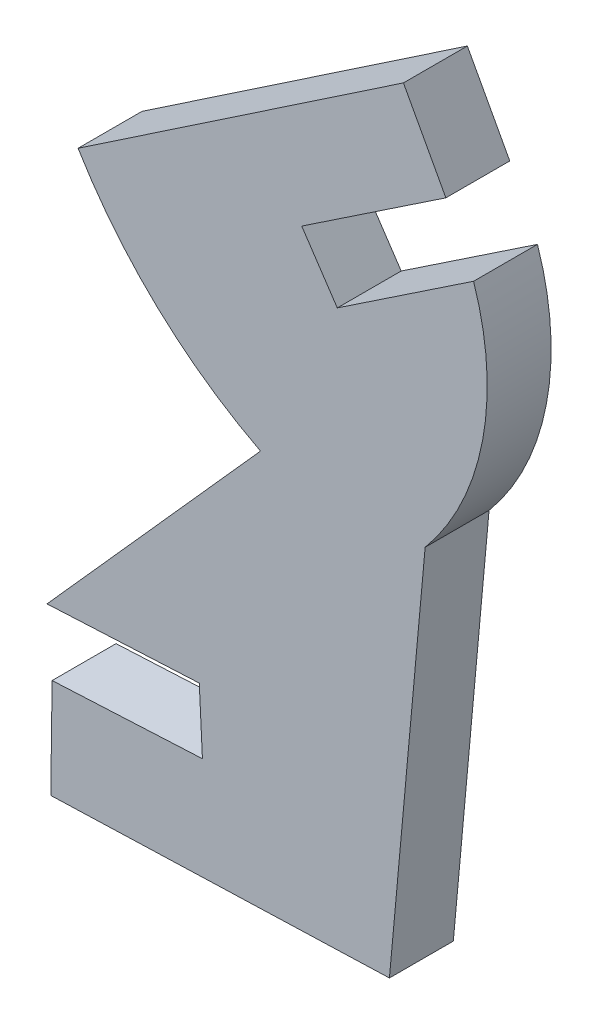
ISO-10303-21;
HEADER;
FILE_DESCRIPTION(('STEP AP214'),'2;1');
FILE_NAME('part.step','',(''),(''),'','','');
FILE_SCHEMA(('AUTOMOTIVE_DESIGN { 1 0 10303 214 1 1 1 1 }'));
ENDSEC;
DATA;
#1=APPLICATION_CONTEXT('core data for automotive mechanical design processes');
#2=APPLICATION_PROTOCOL_DEFINITION('international standard','automotive_design',2000,#1);
#3=PRODUCT_CONTEXT('',#1,'mechanical');
#4=PRODUCT('Part','Part','',(#3));
#5=PRODUCT_RELATED_PRODUCT_CATEGORY('part','',(#4));
#6=PRODUCT_DEFINITION_FORMATION('','',#4);
#7=PRODUCT_DEFINITION_CONTEXT('part definition',#1,'design');
#8=PRODUCT_DEFINITION('design','',#6,#7);
#9=PRODUCT_DEFINITION_SHAPE('','',#8);
#10=(LENGTH_UNIT() NAMED_UNIT(*) SI_UNIT(.MILLI.,.METRE.));
#11=(NAMED_UNIT(*) PLANE_ANGLE_UNIT() SI_UNIT($,.RADIAN.));
#12=(NAMED_UNIT(*) SI_UNIT($,.STERADIAN.) SOLID_ANGLE_UNIT());
#13=UNCERTAINTY_MEASURE_WITH_UNIT(LENGTH_MEASURE(1.E-05),#10,'distance_accuracy_value','');
#14=(GEOMETRIC_REPRESENTATION_CONTEXT(3) GLOBAL_UNCERTAINTY_ASSIGNED_CONTEXT((#13)) GLOBAL_UNIT_ASSIGNED_CONTEXT((#10,
#11,#12)) REPRESENTATION_CONTEXT('',''));
#15=CARTESIAN_POINT('',(0.,0.,0.));
#16=DIRECTION('',(0.,0.,1.));
#17=DIRECTION('',(1.,0.,0.));
#18=AXIS2_PLACEMENT_3D('',#15,#16,#17);
#19=CARTESIAN_POINT('',(155.295598835879,-41.1938991259459,3.));
#20=DIRECTION('',(-0.0332427425840476,0.999447307298134,0.));
#21=DIRECTION('',(-0.999447307298134,-0.0332427425840476,0.));
#22=AXIS2_PLACEMENT_3D('',#19,#20,#21);
#23=PLANE('',#22);
#24=DIRECTION('',(0.999447307298134,0.0332427425840476,0.));
#25=VECTOR('',#24,1.);
#26=CARTESIAN_POINT('',(155.295598835879,-41.1938991259459,0.));
#27=LINE('',#26,#25);
#28=CARTESIAN_POINT('',(155.295598835879,-41.1938991259459,0.));
#29=VERTEX_POINT('',#28);
#30=CARTESIAN_POINT('',(171.19295744218,-40.6651350820022,0.));
#31=VERTEX_POINT('',#30);
#32=EDGE_CURVE('E136',#29,#31,#27,.T.);
#33=ORIENTED_EDGE('',*,*,#32,.T.);
#34=DIRECTION('',(0.,0.,-1.));
#35=VECTOR('',#34,1.);
#36=CARTESIAN_POINT('',(171.19295744218,-40.6651350820022,3.));
#37=LINE('',#36,#35);
#38=CARTESIAN_POINT('',(171.19295744218,-40.6651350820022,3.));
#39=VERTEX_POINT('',#38);
#40=EDGE_CURVE('E11',#39,#31,#37,.T.);
#41=ORIENTED_EDGE('',*,*,#40,.F.);
#42=DIRECTION('',(0.999447307298134,0.0332427425840476,0.));
#43=VECTOR('',#42,1.);
#44=CARTESIAN_POINT('',(155.295598835879,-41.1938991259459,3.));
#45=LINE('',#44,#43);
#46=CARTESIAN_POINT('',(155.295598835879,-41.1938991259459,3.));
#47=VERTEX_POINT('',#46);
#48=EDGE_CURVE('E175',#47,#39,#45,.T.);
#49=ORIENTED_EDGE('',*,*,#48,.F.);
#50=DIRECTION('',(0.,0.,-1.));
#51=VECTOR('',#50,1.);
#52=CARTESIAN_POINT('',(155.295598835879,-41.1938991259459,3.));
#53=LINE('',#52,#51);
#54=EDGE_CURVE('E149',#47,#29,#53,.T.);
#55=ORIENTED_EDGE('',*,*,#54,.T.);
#56=EDGE_LOOP('',(#33,#41,#49,#55));
#57=FACE_BOUND('',#56,.T.);
#58=ADVANCED_FACE('F32',(#57),#23,.F.);
#59=CARTESIAN_POINT('',(171.19295744218,-40.6651350820022,3.));
#60=DIRECTION('',(-0.995849609156195,0.0910140425618661,0.));
#61=DIRECTION('',(-0.0910140425618661,-0.995849609156195,0.));
#62=AXIS2_PLACEMENT_3D('',#59,#60,#61);
#63=PLANE('',#62);
#64=DIRECTION('',(0.0910140425618662,0.995849609156195,0.));
#65=VECTOR('',#64,1.);
#66=CARTESIAN_POINT('',(171.19295744218,-40.6651350820022,0.));
#67=LINE('',#66,#65);
#68=CARTESIAN_POINT('',(172.870030556164,-22.3150809796199,0.));
#69=VERTEX_POINT('',#68);
#70=EDGE_CURVE('E132',#31,#69,#67,.T.);
#71=ORIENTED_EDGE('',*,*,#70,.T.);
#72=DIRECTION('',(0.,0.,-1.));
#73=VECTOR('',#72,1.);
#74=CARTESIAN_POINT('',(172.870030556164,-22.3150809796199,3.));
#75=LINE('',#74,#73);
#76=CARTESIAN_POINT('',(172.870030556164,-22.3150809796199,3.));
#77=VERTEX_POINT('',#76);
#78=EDGE_CURVE('E39',#77,#69,#75,.T.);
#79=ORIENTED_EDGE('',*,*,#78,.F.);
#80=DIRECTION('',(0.0910140425618662,0.995849609156195,0.));
#81=VECTOR('',#80,1.);
#82=CARTESIAN_POINT('',(171.19295744218,-40.6651350820022,3.));
#83=LINE('',#82,#81);
#84=EDGE_CURVE('E145',#39,#77,#83,.T.);
#85=ORIENTED_EDGE('',*,*,#84,.F.);
#86=ORIENTED_EDGE('',*,*,#40,.T.);
#87=EDGE_LOOP('',(#71,#79,#85,#86));
#88=FACE_BOUND('',#87,.T.);
#89=ADVANCED_FACE('F144',(#88),#63,.F.);
#90=CARTESIAN_POINT('',(163.32426821129,-14.3087299020398,3.));
#91=DIRECTION('',(0.,0.,-1.));
#92=DIRECTION('',(-1.,0.,0.));
#93=AXIS2_PLACEMENT_3D('',#90,#91,#92);
#94=CYLINDRICAL_SURFACE('',#93,12.4588617586953);
#95=CARTESIAN_POINT('',(163.32426821129,-14.3087299020398,0.));
#96=DIRECTION('',(0.,0.,1.));
#97=DIRECTION('',(1.,0.,0.));
#98=AXIS2_PLACEMENT_3D('',#95,#96,#97);
#99=CIRCLE('',#98,12.4588617586953);
#100=CARTESIAN_POINT('',(175.142919491838,-10.3663044771169,0.));
#101=VERTEX_POINT('',#100);
#102=EDGE_CURVE('E138',#69,#101,#99,.T.);
#103=ORIENTED_EDGE('',*,*,#102,.T.);
#104=DIRECTION('',(0.,0.,-1.));
#105=VECTOR('',#104,1.);
#106=CARTESIAN_POINT('',(175.142919491838,-10.3663044771169,3.));
#107=LINE('',#106,#105);
#108=CARTESIAN_POINT('',(175.142919491838,-10.3663044771169,3.));
#109=VERTEX_POINT('',#108);
#110=EDGE_CURVE('E231',#109,#101,#107,.T.);
#111=ORIENTED_EDGE('',*,*,#110,.F.);
#112=CARTESIAN_POINT('',(163.32426821129,-14.3087299020398,3.));
#113=DIRECTION('',(0.,0.,1.));
#114=DIRECTION('',(1.,0.,0.));
#115=AXIS2_PLACEMENT_3D('',#112,#113,#114);
#116=CIRCLE('',#115,12.4588617586953);
#117=EDGE_CURVE('E178',#77,#109,#116,.T.);
#118=ORIENTED_EDGE('',*,*,#117,.F.);
#119=ORIENTED_EDGE('',*,*,#78,.T.);
#120=EDGE_LOOP('',(#103,#111,#118,#119));
#121=FACE_BOUND('',#120,.T.);
#122=ADVANCED_FACE('F235',(#121),#94,.T.);
#123=CARTESIAN_POINT('',(175.142919491838,-10.3663044771169,3.));
#124=DIRECTION('',(0.556308239600081,-0.830976018037259,0.));
#125=DIRECTION('',(0.830976018037259,0.556308239600081,0.));
#126=AXIS2_PLACEMENT_3D('',#123,#124,#125);
#127=PLANE('',#126);
#128=DIRECTION('',(-0.830976018037259,-0.556308239600081,0.));
#129=VECTOR('',#128,1.);
#130=CARTESIAN_POINT('',(175.142919491838,-10.3663044771169,0.));
#131=LINE('',#130,#129);
#132=CARTESIAN_POINT('',(168.744811213556,-14.6496054097583,0.));
#133=VERTEX_POINT('',#132);
#134=EDGE_CURVE('E153',#101,#133,#131,.T.);
#135=ORIENTED_EDGE('',*,*,#134,.T.);
#136=DIRECTION('',(0.,0.,-1.));
#137=VECTOR('',#136,1.);
#138=CARTESIAN_POINT('',(168.744811213556,-14.6496054097583,3.));
#139=LINE('',#138,#137);
#140=CARTESIAN_POINT('',(168.744811213556,-14.6496054097583,3.));
#141=VERTEX_POINT('',#140);
#142=EDGE_CURVE('E228',#141,#133,#139,.T.);
#143=ORIENTED_EDGE('',*,*,#142,.F.);
#144=DIRECTION('',(-0.830976018037259,-0.556308239600081,0.));
#145=VECTOR('',#144,1.);
#146=CARTESIAN_POINT('',(175.142919491838,-10.3663044771169,3.));
#147=LINE('',#146,#145);
#148=EDGE_CURVE('E180',#109,#141,#147,.T.);
#149=ORIENTED_EDGE('',*,*,#148,.F.);
#150=ORIENTED_EDGE('',*,*,#110,.T.);
#151=EDGE_LOOP('',(#135,#143,#149,#150));
#152=FACE_BOUND('',#151,.T.);
#153=ADVANCED_FACE('F243',(#152),#127,.F.);
#154=CARTESIAN_POINT('',(168.744811213556,-14.6496054097583,3.));
#155=DIRECTION('',(-0.830976018037261,-0.556308239600078,0.));
#156=DIRECTION('',(0.556308239600078,-0.830976018037261,0.));
#157=AXIS2_PLACEMENT_3D('',#154,#155,#156);
#158=PLANE('',#157);
#159=DIRECTION('',(-0.556308239600078,0.830976018037261,0.));
#160=VECTOR('',#159,1.);
#161=CARTESIAN_POINT('',(168.744811213556,-14.6496054097583,0.));
#162=LINE('',#161,#160);
#163=CARTESIAN_POINT('',(167.075886494756,-12.1566773556466,0.));
#164=VERTEX_POINT('',#163);
#165=EDGE_CURVE('E155',#133,#164,#162,.T.);
#166=ORIENTED_EDGE('',*,*,#165,.T.);
#167=DIRECTION('',(0.,0.,-1.));
#168=VECTOR('',#167,1.);
#169=CARTESIAN_POINT('',(167.075886494756,-12.1566773556466,3.));
#170=LINE('',#169,#168);
#171=CARTESIAN_POINT('',(167.075886494756,-12.1566773556466,3.));
#172=VERTEX_POINT('',#171);
#173=EDGE_CURVE('E225',#172,#164,#170,.T.);
#174=ORIENTED_EDGE('',*,*,#173,.F.);
#175=DIRECTION('',(-0.556308239600078,0.830976018037261,0.));
#176=VECTOR('',#175,1.);
#177=CARTESIAN_POINT('',(168.744811213556,-14.6496054097583,3.));
#178=LINE('',#177,#176);
#179=EDGE_CURVE('E182',#141,#172,#178,.T.);
#180=ORIENTED_EDGE('',*,*,#179,.F.);
#181=ORIENTED_EDGE('',*,*,#142,.T.);
#182=EDGE_LOOP('',(#166,#174,#180,#181));
#183=FACE_BOUND('',#182,.T.);
#184=ADVANCED_FACE('F246',(#183),#158,.F.);
#185=CARTESIAN_POINT('',(167.075886494756,-12.1566773556466,3.));
#186=DIRECTION('',(-0.556308239600081,0.830976018037259,0.));
#187=DIRECTION('',(-0.830976018037259,-0.556308239600081,0.));
#188=AXIS2_PLACEMENT_3D('',#185,#186,#187);
#189=PLANE('',#188);
#190=DIRECTION('',(0.830976018037259,0.556308239600081,0.));
#191=VECTOR('',#190,1.);
#192=CARTESIAN_POINT('',(167.075886494756,-12.1566773556466,0.));
#193=LINE('',#192,#191);
#194=CARTESIAN_POINT('',(173.841852344708,-7.62710914972925,0.));
#195=VERTEX_POINT('',#194);
#196=EDGE_CURVE('E157',#164,#195,#193,.T.);
#197=ORIENTED_EDGE('',*,*,#196,.T.);
#198=DIRECTION('',(0.,0.,-1.));
#199=VECTOR('',#198,1.);
#200=CARTESIAN_POINT('',(173.841852344708,-7.62710914972925,3.));
#201=LINE('',#200,#199);
#202=CARTESIAN_POINT('',(173.841852344708,-7.62710914972925,3.));
#203=VERTEX_POINT('',#202);
#204=EDGE_CURVE('E222',#203,#195,#201,.T.);
#205=ORIENTED_EDGE('',*,*,#204,.F.);
#206=DIRECTION('',(0.830976018037259,0.556308239600081,0.));
#207=VECTOR('',#206,1.);
#208=CARTESIAN_POINT('',(167.075886494756,-12.1566773556466,3.));
#209=LINE('',#208,#207);
#210=EDGE_CURVE('E184',#172,#203,#209,.T.);
#211=ORIENTED_EDGE('',*,*,#210,.F.);
#212=ORIENTED_EDGE('',*,*,#173,.T.);
#213=EDGE_LOOP('',(#197,#205,#211,#212));
#214=FACE_BOUND('',#213,.T.);
#215=ADVANCED_FACE('F251',(#214),#189,.F.);
#216=CARTESIAN_POINT('',(173.841852344708,-7.62710914972925,3.));
#217=DIRECTION('',(-0.879337576268163,-0.476198936331059,0.));
#218=DIRECTION('',(0.476198936331059,-0.879337576268163,0.));
#219=AXIS2_PLACEMENT_3D('',#216,#217,#218);
#220=PLANE('',#219);
#221=DIRECTION('',(-0.47619893633106,0.879337576268163,0.));
#222=VECTOR('',#221,1.);
#223=CARTESIAN_POINT('',(173.841852344708,-7.62710914972925,0.));
#224=LINE('',#223,#222);
#225=CARTESIAN_POINT('',(171.850357265324,-3.94966192620568,0.));
#226=VERTEX_POINT('',#225);
#227=EDGE_CURVE('E159',#195,#226,#224,.T.);
#228=ORIENTED_EDGE('',*,*,#227,.T.);
#229=DIRECTION('',(0.,0.,-1.));
#230=VECTOR('',#229,1.);
#231=CARTESIAN_POINT('',(171.850357265324,-3.94966192620568,3.));
#232=LINE('',#231,#230);
#233=CARTESIAN_POINT('',(171.850357265324,-3.94966192620568,3.));
#234=VERTEX_POINT('',#233);
#235=EDGE_CURVE('E219',#234,#226,#232,.T.);
#236=ORIENTED_EDGE('',*,*,#235,.F.);
#237=DIRECTION('',(-0.47619893633106,0.879337576268163,0.));
#238=VECTOR('',#237,1.);
#239=CARTESIAN_POINT('',(173.841852344708,-7.62710914972925,3.));
#240=LINE('',#239,#238);
#241=EDGE_CURVE('E186',#203,#234,#240,.T.);
#242=ORIENTED_EDGE('',*,*,#241,.F.);
#243=ORIENTED_EDGE('',*,*,#204,.T.);
#244=EDGE_LOOP('',(#228,#236,#242,#243));
#245=FACE_BOUND('',#244,.T.);
#246=ADVANCED_FACE('F257',(#245),#220,.F.);
#247=CARTESIAN_POINT('',(171.850357265324,-3.94966192620568,3.));
#248=DIRECTION('',(0.558860818011676,-0.829261470280225,0.));
#249=DIRECTION('',(0.829261470280225,0.558860818011676,0.));
#250=AXIS2_PLACEMENT_3D('',#247,#248,#249);
#251=PLANE('',#250);
#252=DIRECTION('',(-0.829261470280225,-0.558860818011676,0.));
#253=VECTOR('',#252,1.);
#254=CARTESIAN_POINT('',(171.850357265324,-3.94966192620568,0.));
#255=LINE('',#254,#253);
#256=CARTESIAN_POINT('',(156.578082960375,-14.2420437826528,0.));
#257=VERTEX_POINT('',#256);
#258=EDGE_CURVE('E161',#226,#257,#255,.T.);
#259=ORIENTED_EDGE('',*,*,#258,.T.);
#260=DIRECTION('',(0.,0.,-1.));
#261=VECTOR('',#260,1.);
#262=CARTESIAN_POINT('',(156.578082960375,-14.2420437826528,3.));
#263=LINE('',#262,#261);
#264=CARTESIAN_POINT('',(156.578082960375,-14.2420437826528,3.));
#265=VERTEX_POINT('',#264);
#266=EDGE_CURVE('E216',#265,#257,#263,.T.);
#267=ORIENTED_EDGE('',*,*,#266,.F.);
#268=DIRECTION('',(-0.829261470280225,-0.558860818011676,0.));
#269=VECTOR('',#268,1.);
#270=CARTESIAN_POINT('',(171.850357265324,-3.94966192620568,3.));
#271=LINE('',#270,#269);
#272=EDGE_CURVE('E188',#234,#265,#271,.T.);
#273=ORIENTED_EDGE('',*,*,#272,.F.);
#274=ORIENTED_EDGE('',*,*,#235,.T.);
#275=EDGE_LOOP('',(#259,#267,#273,#274));
#276=FACE_BOUND('',#275,.T.);
#277=ADVANCED_FACE('F261',(#276),#251,.F.);
#278=CARTESIAN_POINT('',(175.020876678863,-3.15397513301595,3.));
#279=DIRECTION('',(0.,0.,-1.));
#280=DIRECTION('',(-1.,0.,0.));
#281=AXIS2_PLACEMENT_3D('',#278,#279,#280);
#282=CYLINDRICAL_SURFACE('',#281,21.5193379666237);
#283=CARTESIAN_POINT('',(175.020876678863,-3.15397513301595,0.));
#284=DIRECTION('',(0.,0.,1.));
#285=DIRECTION('',(1.,0.,0.));
#286=AXIS2_PLACEMENT_3D('',#283,#284,#285);
#287=CIRCLE('',#286,21.5193379666237);
#288=CARTESIAN_POINT('',(165.140644270391,-22.2710594838355,0.));
#289=VERTEX_POINT('',#288);
#290=EDGE_CURVE('E163',#257,#289,#287,.T.);
#291=ORIENTED_EDGE('',*,*,#290,.T.);
#292=DIRECTION('',(0.,0.,-1.));
#293=VECTOR('',#292,1.);
#294=CARTESIAN_POINT('',(165.140644270391,-22.2710594838355,3.));
#295=LINE('',#294,#293);
#296=CARTESIAN_POINT('',(165.140644270391,-22.2710594838355,3.));
#297=VERTEX_POINT('',#296);
#298=EDGE_CURVE('E213',#297,#289,#295,.T.);
#299=ORIENTED_EDGE('',*,*,#298,.F.);
#300=CARTESIAN_POINT('',(175.020876678863,-3.15397513301595,3.));
#301=DIRECTION('',(0.,0.,1.));
#302=DIRECTION('',(1.,0.,0.));
#303=AXIS2_PLACEMENT_3D('',#300,#301,#302);
#304=CIRCLE('',#303,21.5193379666237);
#305=EDGE_CURVE('E190',#265,#297,#304,.T.);
#306=ORIENTED_EDGE('',*,*,#305,.F.);
#307=ORIENTED_EDGE('',*,*,#266,.T.);
#308=EDGE_LOOP('',(#291,#299,#306,#307));
#309=FACE_BOUND('',#308,.T.);
#310=ADVANCED_FACE('F266',(#309),#282,.T.);
#311=CARTESIAN_POINT('',(165.140644270391,-22.2710594838355,3.));
#312=DIRECTION('',(0.745889748074085,-0.666069428601837,0.));
#313=DIRECTION('',(0.666069428601837,0.745889748074085,0.));
#314=AXIS2_PLACEMENT_3D('',#311,#312,#313);
#315=PLANE('',#314);
#316=DIRECTION('',(-0.666069428601837,-0.745889748074085,0.));
#317=VECTOR('',#316,1.);
#318=CARTESIAN_POINT('',(165.140644270391,-22.2710594838355,0.));
#319=LINE('',#318,#317);
#320=CARTESIAN_POINT('',(155.118780374341,-33.4939218697414,0.));
#321=VERTEX_POINT('',#320);
#322=EDGE_CURVE('E165',#289,#321,#319,.T.);
#323=ORIENTED_EDGE('',*,*,#322,.T.);
#324=DIRECTION('',(0.,0.,-1.));
#325=VECTOR('',#324,1.);
#326=CARTESIAN_POINT('',(155.118780374341,-33.4939218697414,3.));
#327=LINE('',#326,#325);
#328=CARTESIAN_POINT('',(155.118780374341,-33.4939218697414,3.));
#329=VERTEX_POINT('',#328);
#330=EDGE_CURVE('E210',#329,#321,#327,.T.);
#331=ORIENTED_EDGE('',*,*,#330,.F.);
#332=DIRECTION('',(-0.666069428601837,-0.745889748074085,0.));
#333=VECTOR('',#332,1.);
#334=CARTESIAN_POINT('',(165.140644270391,-22.2710594838355,3.));
#335=LINE('',#334,#333);
#336=EDGE_CURVE('E192',#297,#329,#335,.T.);
#337=ORIENTED_EDGE('',*,*,#336,.F.);
#338=ORIENTED_EDGE('',*,*,#298,.T.);
#339=EDGE_LOOP('',(#323,#331,#337,#338));
#340=FACE_BOUND('',#339,.T.);
#341=ADVANCED_FACE('F272',(#340),#315,.F.);
#342=CARTESIAN_POINT('',(155.118780374341,-33.4939218697414,3.));
#343=DIRECTION('',(-0.0493913800734275,0.99877950097829,0.));
#344=DIRECTION('',(-0.99877950097829,-0.0493913800734275,0.));
#345=AXIS2_PLACEMENT_3D('',#342,#343,#344);
#346=PLANE('',#345);
#347=DIRECTION('',(0.99877950097829,0.0493913800734275,0.));
#348=VECTOR('',#347,1.);
#349=CARTESIAN_POINT('',(155.118780374341,-33.4939218697414,0.));
#350=LINE('',#349,#348);
#351=CARTESIAN_POINT('',(162.266864395797,-33.1404367067453,0.));
#352=VERTEX_POINT('',#351);
#353=EDGE_CURVE('E167',#321,#352,#350,.T.);
#354=ORIENTED_EDGE('',*,*,#353,.T.);
#355=DIRECTION('',(0.,0.,-1.));
#356=VECTOR('',#355,1.);
#357=CARTESIAN_POINT('',(162.266864395797,-33.1404367067453,3.));
#358=LINE('',#357,#356);
#359=CARTESIAN_POINT('',(162.266864395797,-33.1404367067453,3.));
#360=VERTEX_POINT('',#359);
#361=EDGE_CURVE('E207',#360,#352,#358,.T.);
#362=ORIENTED_EDGE('',*,*,#361,.F.);
#363=DIRECTION('',(0.99877950097829,0.0493913800734275,0.));
#364=VECTOR('',#363,1.);
#365=CARTESIAN_POINT('',(155.118780374341,-33.4939218697414,3.));
#366=LINE('',#365,#364);
#367=EDGE_CURVE('E194',#329,#360,#366,.T.);
#368=ORIENTED_EDGE('',*,*,#367,.F.);
#369=ORIENTED_EDGE('',*,*,#330,.T.);
#370=EDGE_LOOP('',(#354,#362,#368,#369));
#371=FACE_BOUND('',#370,.T.);
#372=ADVANCED_FACE('F276',(#371),#346,.F.);
#373=CARTESIAN_POINT('',(162.266864395797,-33.1404367067453,3.));
#374=DIRECTION('',(0.99877950097829,0.0493913800734278,0.));
#375=DIRECTION('',(-0.0493913800734278,0.99877950097829,0.));
#376=AXIS2_PLACEMENT_3D('',#373,#374,#375);
#377=PLANE('',#376);
#378=DIRECTION('',(0.0493913800734278,-0.99877950097829,0.));
#379=VECTOR('',#378,1.);
#380=CARTESIAN_POINT('',(162.266864395797,-33.1404367067453,0.));
#381=LINE('',#380,#379);
#382=CARTESIAN_POINT('',(162.415219603403,-36.1404367067453,0.));
#383=VERTEX_POINT('',#382);
#384=EDGE_CURVE('E169',#352,#383,#381,.T.);
#385=ORIENTED_EDGE('',*,*,#384,.T.);
#386=DIRECTION('',(0.,0.,-1.));
#387=VECTOR('',#386,1.);
#388=CARTESIAN_POINT('',(162.415219603403,-36.1404367067453,3.));
#389=LINE('',#388,#387);
#390=CARTESIAN_POINT('',(162.415219603403,-36.1404367067453,3.));
#391=VERTEX_POINT('',#390);
#392=EDGE_CURVE('E204',#391,#383,#389,.T.);
#393=ORIENTED_EDGE('',*,*,#392,.F.);
#394=DIRECTION('',(0.0493913800734278,-0.99877950097829,0.));
#395=VECTOR('',#394,1.);
#396=CARTESIAN_POINT('',(162.266864395797,-33.1404367067453,3.));
#397=LINE('',#396,#395);
#398=EDGE_CURVE('E196',#360,#391,#397,.T.);
#399=ORIENTED_EDGE('',*,*,#398,.F.);
#400=ORIENTED_EDGE('',*,*,#361,.T.);
#401=EDGE_LOOP('',(#385,#393,#399,#400));
#402=FACE_BOUND('',#401,.T.);
#403=ADVANCED_FACE('F281',(#402),#377,.F.);
#404=CARTESIAN_POINT('',(162.415219603403,-36.1404367067453,3.));
#405=DIRECTION('',(0.0493913800734281,-0.99877950097829,0.));
#406=DIRECTION('',(0.99877950097829,0.0493913800734281,0.));
#407=AXIS2_PLACEMENT_3D('',#404,#405,#406);
#408=PLANE('',#407);
#409=DIRECTION('',(-0.99877950097829,-0.0493913800734281,0.));
#410=VECTOR('',#409,1.);
#411=CARTESIAN_POINT('',(162.415219603403,-36.1404367067453,0.));
#412=LINE('',#411,#410);
#413=CARTESIAN_POINT('',(155.3593966373,-36.4893594004012,0.));
#414=VERTEX_POINT('',#413);
#415=EDGE_CURVE('E171',#383,#414,#412,.T.);
#416=ORIENTED_EDGE('',*,*,#415,.T.);
#417=DIRECTION('',(0.,0.,-1.));
#418=VECTOR('',#417,1.);
#419=CARTESIAN_POINT('',(155.3593966373,-36.4893594004012,3.));
#420=LINE('',#419,#418);
#421=CARTESIAN_POINT('',(155.3593966373,-36.4893594004012,3.));
#422=VERTEX_POINT('',#421);
#423=EDGE_CURVE('E201',#422,#414,#420,.T.);
#424=ORIENTED_EDGE('',*,*,#423,.F.);
#425=DIRECTION('',(-0.99877950097829,-0.0493913800734281,0.));
#426=VECTOR('',#425,1.);
#427=CARTESIAN_POINT('',(162.415219603403,-36.1404367067453,3.));
#428=LINE('',#427,#426);
#429=EDGE_CURVE('E51',#391,#422,#428,.T.);
#430=ORIENTED_EDGE('',*,*,#429,.F.);
#431=ORIENTED_EDGE('',*,*,#392,.T.);
#432=EDGE_LOOP('',(#416,#424,#430,#431));
#433=FACE_BOUND('',#432,.T.);
#434=ADVANCED_FACE('F284',(#433),#408,.F.);
#435=CARTESIAN_POINT('',(155.3593966373,-36.4893594004012,3.));
#436=DIRECTION('',(0.999908063650635,-0.0135596551002021,0.));
#437=DIRECTION('',(0.0135596551002021,0.999908063650636,0.));
#438=AXIS2_PLACEMENT_3D('',#435,#436,#437);
#439=PLANE('',#438);
#440=DIRECTION('',(-0.0135596551002021,-0.999908063650636,0.));
#441=VECTOR('',#440,1.);
#442=CARTESIAN_POINT('',(155.3593966373,-36.4893594004012,0.));
#443=LINE('',#442,#441);
#444=EDGE_CURVE('E173',#414,#29,#443,.T.);
#445=ORIENTED_EDGE('',*,*,#444,.T.);
#446=ORIENTED_EDGE('',*,*,#54,.F.);
#447=DIRECTION('',(-0.0135596551002021,-0.999908063650636,0.));
#448=VECTOR('',#447,1.);
#449=CARTESIAN_POINT('',(155.3593966373,-36.4893594004012,3.));
#450=LINE('',#449,#448);
#451=EDGE_CURVE('E46',#422,#47,#450,.T.);
#452=ORIENTED_EDGE('',*,*,#451,.F.);
#453=ORIENTED_EDGE('',*,*,#423,.T.);
#454=EDGE_LOOP('',(#445,#446,#452,#453));
#455=FACE_BOUND('',#454,.T.);
#456=ADVANCED_FACE('F286',(#455),#439,.F.);
#457=CARTESIAN_POINT('',(163.32426821129,-14.3087299020398,3.));
#458=DIRECTION('',(0.,0.,1.));
#459=DIRECTION('',(1.,0.,0.));
#460=AXIS2_PLACEMENT_3D('',#457,#458,#459);
#461=PLANE('',#460);
#462=ORIENTED_EDGE('',*,*,#48,.T.);
#463=ORIENTED_EDGE('',*,*,#84,.T.);
#464=ORIENTED_EDGE('',*,*,#117,.T.);
#465=ORIENTED_EDGE('',*,*,#148,.T.);
#466=ORIENTED_EDGE('',*,*,#179,.T.);
#467=ORIENTED_EDGE('',*,*,#210,.T.);
#468=ORIENTED_EDGE('',*,*,#241,.T.);
#469=ORIENTED_EDGE('',*,*,#272,.T.);
#470=ORIENTED_EDGE('',*,*,#305,.T.);
#471=ORIENTED_EDGE('',*,*,#336,.T.);
#472=ORIENTED_EDGE('',*,*,#367,.T.);
#473=ORIENTED_EDGE('',*,*,#398,.T.);
#474=ORIENTED_EDGE('',*,*,#429,.T.);
#475=ORIENTED_EDGE('',*,*,#451,.T.);
#476=EDGE_LOOP('',(#462,#463,#464,#465,#466,#467,#468,#469,#470,#471,#472,#473,#474,#475));
#477=FACE_BOUND('',#476,.T.);
#478=ADVANCED_FACE('F238',(#477),#461,.T.);
#479=CARTESIAN_POINT('',(163.32426821129,-14.3087299020398,0.));
#480=DIRECTION('',(0.,0.,1.));
#481=DIRECTION('',(1.,0.,0.));
#482=AXIS2_PLACEMENT_3D('',#479,#480,#481);
#483=PLANE('',#482);
#484=ORIENTED_EDGE('',*,*,#32,.F.);
#485=ORIENTED_EDGE('',*,*,#444,.F.);
#486=ORIENTED_EDGE('',*,*,#415,.F.);
#487=ORIENTED_EDGE('',*,*,#384,.F.);
#488=ORIENTED_EDGE('',*,*,#353,.F.);
#489=ORIENTED_EDGE('',*,*,#322,.F.);
#490=ORIENTED_EDGE('',*,*,#290,.F.);
#491=ORIENTED_EDGE('',*,*,#258,.F.);
#492=ORIENTED_EDGE('',*,*,#227,.F.);
#493=ORIENTED_EDGE('',*,*,#196,.F.);
#494=ORIENTED_EDGE('',*,*,#165,.F.);
#495=ORIENTED_EDGE('',*,*,#134,.F.);
#496=ORIENTED_EDGE('',*,*,#102,.F.);
#497=ORIENTED_EDGE('',*,*,#70,.F.);
#498=EDGE_LOOP('',(#484,#485,#486,#487,#488,#489,#490,#491,#492,#493,#494,#495,#496,#497));
#499=FACE_BOUND('',#498,.T.);
#500=ADVANCED_FACE('F133',(#499),#483,.F.);
#501=CLOSED_SHELL('',(#58,#89,#122,#153,#184,#215,#246,#277,#310,#341,#372,#403,#434,#456,#478,#500));
#502=MANIFOLD_SOLID_BREP('B2',#501);
#503=ADVANCED_BREP_SHAPE_REPRESENTATION('',(#18,#502),#14);
#504=SHAPE_DEFINITION_REPRESENTATION(#9,#503);
ENDSEC;
END-ISO-10303-21;
